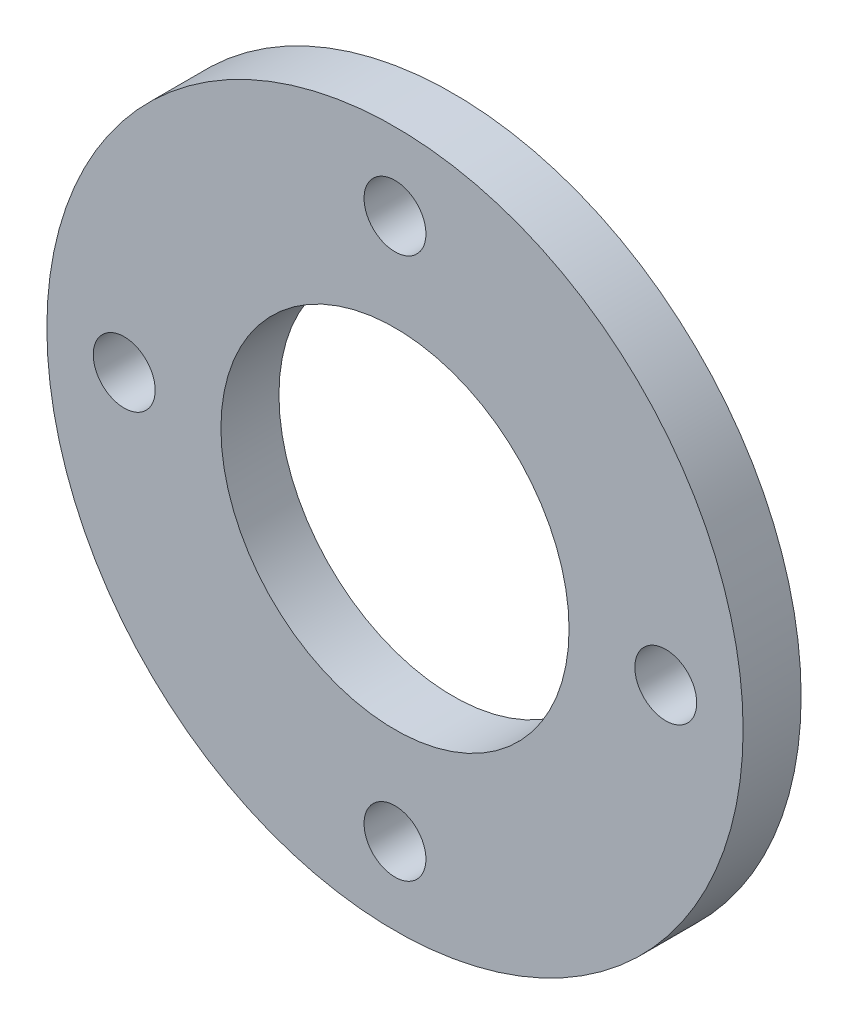
ISO-10303-21;
HEADER;
FILE_DESCRIPTION(('STEP AP214'),'2;1');
FILE_NAME('part.step','',(''),(''),'','','');
FILE_SCHEMA(('AUTOMOTIVE_DESIGN { 1 0 10303 214 1 1 1 1 }'));
ENDSEC;
DATA;
#1=APPLICATION_CONTEXT('core data for automotive mechanical design processes');
#2=APPLICATION_PROTOCOL_DEFINITION('international standard','automotive_design',2000,#1);
#3=PRODUCT_CONTEXT('',#1,'mechanical');
#4=PRODUCT('Part','Part','',(#3));
#5=PRODUCT_RELATED_PRODUCT_CATEGORY('part','',(#4));
#6=PRODUCT_DEFINITION_FORMATION('','',#4);
#7=PRODUCT_DEFINITION_CONTEXT('part definition',#1,'design');
#8=PRODUCT_DEFINITION('design','',#6,#7);
#9=PRODUCT_DEFINITION_SHAPE('','',#8);
#10=(LENGTH_UNIT() NAMED_UNIT(*) SI_UNIT(.MILLI.,.METRE.));
#11=(NAMED_UNIT(*) PLANE_ANGLE_UNIT() SI_UNIT($,.RADIAN.));
#12=(NAMED_UNIT(*) SI_UNIT($,.STERADIAN.) SOLID_ANGLE_UNIT());
#13=UNCERTAINTY_MEASURE_WITH_UNIT(LENGTH_MEASURE(1.E-05),#10,'distance_accuracy_value','');
#14=(GEOMETRIC_REPRESENTATION_CONTEXT(3) GLOBAL_UNCERTAINTY_ASSIGNED_CONTEXT((#13)) GLOBAL_UNIT_ASSIGNED_CONTEXT((#10,
#11,#12)) REPRESENTATION_CONTEXT('',''));
#15=CARTESIAN_POINT('',(0.,0.,0.));
#16=DIRECTION('',(0.,0.,1.));
#17=DIRECTION('',(1.,0.,0.));
#18=AXIS2_PLACEMENT_3D('',#15,#16,#17);
#19=CARTESIAN_POINT('',(0.,0.,3.));
#20=DIRECTION('',(0.,0.,1.));
#21=DIRECTION('',(1.,0.,0.));
#22=AXIS2_PLACEMENT_3D('',#19,#20,#21);
#23=PLANE('',#22);
#24=CARTESIAN_POINT('',(0.,-14.,3.));
#25=DIRECTION('',(0.,0.,1.));
#26=DIRECTION('',(1.,0.,0.));
#27=AXIS2_PLACEMENT_3D('',#24,#25,#26);
#28=CIRCLE('',#27,1.60000000000005);
#29=CARTESIAN_POINT('',(1.60000000000005,-14.,3.));
#30=VERTEX_POINT('',#29);
#31=EDGE_CURVE('E59',#30,#30,#28,.T.);
#32=ORIENTED_EDGE('',*,*,#31,.F.);
#33=EDGE_LOOP('',(#32));
#34=FACE_BOUND('',#33,.T.);
#35=CARTESIAN_POINT('',(0.,14.,3.));
#36=DIRECTION('',(0.,0.,1.));
#37=DIRECTION('',(1.,0.,0.));
#38=AXIS2_PLACEMENT_3D('',#35,#36,#37);
#39=CIRCLE('',#38,1.60000000000005);
#40=CARTESIAN_POINT('',(1.60000000000005,14.,3.));
#41=VERTEX_POINT('',#40);
#42=EDGE_CURVE('E47',#41,#41,#39,.T.);
#43=ORIENTED_EDGE('',*,*,#42,.F.);
#44=EDGE_LOOP('',(#43));
#45=FACE_BOUND('',#44,.T.);
#46=CARTESIAN_POINT('',(0.,0.,3.));
#47=DIRECTION('',(0.,0.,1.));
#48=DIRECTION('',(1.,0.,0.));
#49=AXIS2_PLACEMENT_3D('',#46,#47,#48);
#50=CIRCLE('',#49,18.);
#51=CARTESIAN_POINT('',(18.,0.,3.));
#52=VERTEX_POINT('',#51);
#53=EDGE_CURVE('E10',#52,#52,#50,.T.);
#54=ORIENTED_EDGE('',*,*,#53,.T.);
#55=EDGE_LOOP('',(#54));
#56=FACE_BOUND('',#55,.T.);
#57=CARTESIAN_POINT('',(0.,0.,3.));
#58=DIRECTION('',(0.,0.,1.));
#59=DIRECTION('',(1.,0.,0.));
#60=AXIS2_PLACEMENT_3D('',#57,#58,#59);
#61=CIRCLE('',#60,8.9999999999999);
#62=CARTESIAN_POINT('',(8.9999999999999,0.,3.));
#63=VERTEX_POINT('',#62);
#64=EDGE_CURVE('E42',#63,#63,#61,.T.);
#65=ORIENTED_EDGE('',*,*,#64,.F.);
#66=EDGE_LOOP('',(#65));
#67=FACE_BOUND('',#66,.T.);
#68=CARTESIAN_POINT('',(-14.,0.,3.));
#69=DIRECTION('',(0.,0.,1.));
#70=DIRECTION('',(1.,0.,0.));
#71=AXIS2_PLACEMENT_3D('',#68,#69,#70);
#72=CIRCLE('',#71,1.60000000000005);
#73=CARTESIAN_POINT('',(-12.4,0.,3.));
#74=VERTEX_POINT('',#73);
#75=EDGE_CURVE('E53',#74,#74,#72,.T.);
#76=ORIENTED_EDGE('',*,*,#75,.F.);
#77=EDGE_LOOP('',(#76));
#78=FACE_BOUND('',#77,.T.);
#79=CARTESIAN_POINT('',(14.,0.,3.));
#80=DIRECTION('',(0.,0.,1.));
#81=DIRECTION('',(1.,0.,0.));
#82=AXIS2_PLACEMENT_3D('',#79,#80,#81);
#83=CIRCLE('',#82,1.60000000000005);
#84=CARTESIAN_POINT('',(15.6000000000001,0.,3.));
#85=VERTEX_POINT('',#84);
#86=EDGE_CURVE('E65',#85,#85,#83,.T.);
#87=ORIENTED_EDGE('',*,*,#86,.F.);
#88=EDGE_LOOP('',(#87));
#89=FACE_BOUND('',#88,.T.);
#90=ADVANCED_FACE('F31',(#34,#45,#56,#67,#78,#89),#23,.T.);
#91=CARTESIAN_POINT('',(0.,0.,0.));
#92=DIRECTION('',(0.,0.,1.));
#93=DIRECTION('',(1.,0.,0.));
#94=AXIS2_PLACEMENT_3D('',#91,#92,#93);
#95=PLANE('',#94);
#96=CARTESIAN_POINT('',(0.,0.,0.));
#97=DIRECTION('',(0.,0.,1.));
#98=DIRECTION('',(1.,0.,0.));
#99=AXIS2_PLACEMENT_3D('',#96,#97,#98);
#100=CIRCLE('',#99,18.);
#101=CARTESIAN_POINT('',(18.,0.,0.));
#102=VERTEX_POINT('',#101);
#103=EDGE_CURVE('E35',#102,#102,#100,.T.);
#104=ORIENTED_EDGE('',*,*,#103,.F.);
#105=EDGE_LOOP('',(#104));
#106=FACE_BOUND('',#105,.T.);
#107=CARTESIAN_POINT('',(0.,0.,0.));
#108=DIRECTION('',(0.,0.,1.));
#109=DIRECTION('',(1.,0.,0.));
#110=AXIS2_PLACEMENT_3D('',#107,#108,#109);
#111=CIRCLE('',#110,8.9999999999999);
#112=CARTESIAN_POINT('',(8.9999999999999,0.,0.));
#113=VERTEX_POINT('',#112);
#114=EDGE_CURVE('E44',#113,#113,#111,.T.);
#115=ORIENTED_EDGE('',*,*,#114,.T.);
#116=EDGE_LOOP('',(#115));
#117=FACE_BOUND('',#116,.T.);
#118=CARTESIAN_POINT('',(0.,14.,0.));
#119=DIRECTION('',(0.,0.,1.));
#120=DIRECTION('',(1.,0.,0.));
#121=AXIS2_PLACEMENT_3D('',#118,#119,#120);
#122=CIRCLE('',#121,1.60000000000005);
#123=CARTESIAN_POINT('',(1.60000000000005,14.,0.));
#124=VERTEX_POINT('',#123);
#125=EDGE_CURVE('E50',#124,#124,#122,.T.);
#126=ORIENTED_EDGE('',*,*,#125,.T.);
#127=EDGE_LOOP('',(#126));
#128=FACE_BOUND('',#127,.T.);
#129=CARTESIAN_POINT('',(-14.,0.,0.));
#130=DIRECTION('',(0.,0.,1.));
#131=DIRECTION('',(1.,0.,0.));
#132=AXIS2_PLACEMENT_3D('',#129,#130,#131);
#133=CIRCLE('',#132,1.60000000000005);
#134=CARTESIAN_POINT('',(-12.4,0.,0.));
#135=VERTEX_POINT('',#134);
#136=EDGE_CURVE('E56',#135,#135,#133,.T.);
#137=ORIENTED_EDGE('',*,*,#136,.T.);
#138=EDGE_LOOP('',(#137));
#139=FACE_BOUND('',#138,.T.);
#140=CARTESIAN_POINT('',(0.,-14.,0.));
#141=DIRECTION('',(0.,0.,1.));
#142=DIRECTION('',(1.,0.,0.));
#143=AXIS2_PLACEMENT_3D('',#140,#141,#142);
#144=CIRCLE('',#143,1.60000000000005);
#145=CARTESIAN_POINT('',(1.60000000000005,-14.,0.));
#146=VERTEX_POINT('',#145);
#147=EDGE_CURVE('E62',#146,#146,#144,.T.);
#148=ORIENTED_EDGE('',*,*,#147,.T.);
#149=EDGE_LOOP('',(#148));
#150=FACE_BOUND('',#149,.T.);
#151=CARTESIAN_POINT('',(14.,0.,0.));
#152=DIRECTION('',(0.,0.,1.));
#153=DIRECTION('',(1.,0.,0.));
#154=AXIS2_PLACEMENT_3D('',#151,#152,#153);
#155=CIRCLE('',#154,1.60000000000005);
#156=CARTESIAN_POINT('',(15.6000000000001,0.,0.));
#157=VERTEX_POINT('',#156);
#158=EDGE_CURVE('E68',#157,#157,#155,.T.);
#159=ORIENTED_EDGE('',*,*,#158,.T.);
#160=EDGE_LOOP('',(#159));
#161=FACE_BOUND('',#160,.T.);
#162=ADVANCED_FACE('F78',(#106,#117,#128,#139,#150,#161),#95,.F.);
#163=CARTESIAN_POINT('',(0.,0.,3.));
#164=DIRECTION('',(0.,0.,-1.));
#165=DIRECTION('',(-1.,0.,0.));
#166=AXIS2_PLACEMENT_3D('',#163,#164,#165);
#167=CYLINDRICAL_SURFACE('',#166,18.);
#168=ORIENTED_EDGE('',*,*,#53,.F.);
#169=EDGE_LOOP('',(#168));
#170=FACE_BOUND('',#169,.T.);
#171=ORIENTED_EDGE('',*,*,#103,.T.);
#172=EDGE_LOOP('',(#171));
#173=FACE_BOUND('',#172,.T.);
#174=ADVANCED_FACE('F33',(#170,#173),#167,.T.);
#175=CARTESIAN_POINT('',(0.,0.,3.));
#176=DIRECTION('',(0.,0.,-1.));
#177=DIRECTION('',(-1.,0.,0.));
#178=AXIS2_PLACEMENT_3D('',#175,#176,#177);
#179=CYLINDRICAL_SURFACE('',#178,8.9999999999999);
#180=ORIENTED_EDGE('',*,*,#64,.T.);
#181=EDGE_LOOP('',(#180));
#182=FACE_BOUND('',#181,.T.);
#183=ORIENTED_EDGE('',*,*,#114,.F.);
#184=EDGE_LOOP('',(#183));
#185=FACE_BOUND('',#184,.T.);
#186=ADVANCED_FACE('F88',(#182,#185),#179,.F.);
#187=CARTESIAN_POINT('',(0.,14.,3.));
#188=DIRECTION('',(0.,0.,-1.));
#189=DIRECTION('',(-1.,0.,0.));
#190=AXIS2_PLACEMENT_3D('',#187,#188,#189);
#191=CYLINDRICAL_SURFACE('',#190,1.60000000000005);
#192=ORIENTED_EDGE('',*,*,#42,.T.);
#193=EDGE_LOOP('',(#192));
#194=FACE_BOUND('',#193,.T.);
#195=ORIENTED_EDGE('',*,*,#125,.F.);
#196=EDGE_LOOP('',(#195));
#197=FACE_BOUND('',#196,.T.);
#198=ADVANCED_FACE('F91',(#194,#197),#191,.F.);
#199=CARTESIAN_POINT('',(-14.,0.,3.));
#200=DIRECTION('',(0.,0.,-1.));
#201=DIRECTION('',(-1.,0.,0.));
#202=AXIS2_PLACEMENT_3D('',#199,#200,#201);
#203=CYLINDRICAL_SURFACE('',#202,1.60000000000005);
#204=ORIENTED_EDGE('',*,*,#75,.T.);
#205=EDGE_LOOP('',(#204));
#206=FACE_BOUND('',#205,.T.);
#207=ORIENTED_EDGE('',*,*,#136,.F.);
#208=EDGE_LOOP('',(#207));
#209=FACE_BOUND('',#208,.T.);
#210=ADVANCED_FACE('F95',(#206,#209),#203,.F.);
#211=CARTESIAN_POINT('',(0.,-14.,3.));
#212=DIRECTION('',(0.,0.,-1.));
#213=DIRECTION('',(-1.,0.,0.));
#214=AXIS2_PLACEMENT_3D('',#211,#212,#213);
#215=CYLINDRICAL_SURFACE('',#214,1.60000000000005);
#216=ORIENTED_EDGE('',*,*,#31,.T.);
#217=EDGE_LOOP('',(#216));
#218=FACE_BOUND('',#217,.T.);
#219=ORIENTED_EDGE('',*,*,#147,.F.);
#220=EDGE_LOOP('',(#219));
#221=FACE_BOUND('',#220,.T.);
#222=ADVANCED_FACE('F99',(#218,#221),#215,.F.);
#223=CARTESIAN_POINT('',(14.,0.,3.));
#224=DIRECTION('',(0.,0.,-1.));
#225=DIRECTION('',(-1.,0.,0.));
#226=AXIS2_PLACEMENT_3D('',#223,#224,#225);
#227=CYLINDRICAL_SURFACE('',#226,1.60000000000005);
#228=ORIENTED_EDGE('',*,*,#86,.T.);
#229=EDGE_LOOP('',(#228));
#230=FACE_BOUND('',#229,.T.);
#231=ORIENTED_EDGE('',*,*,#158,.F.);
#232=EDGE_LOOP('',(#231));
#233=FACE_BOUND('',#232,.T.);
#234=ADVANCED_FACE('F74',(#230,#233),#227,.F.);
#235=CLOSED_SHELL('',(#90,#162,#174,#186,#198,#210,#222,#234));
#236=MANIFOLD_SOLID_BREP('B2',#235);
#237=ADVANCED_BREP_SHAPE_REPRESENTATION('',(#18,#236),#14);
#238=SHAPE_DEFINITION_REPRESENTATION(#9,#237);
ENDSEC;
END-ISO-10303-21;
